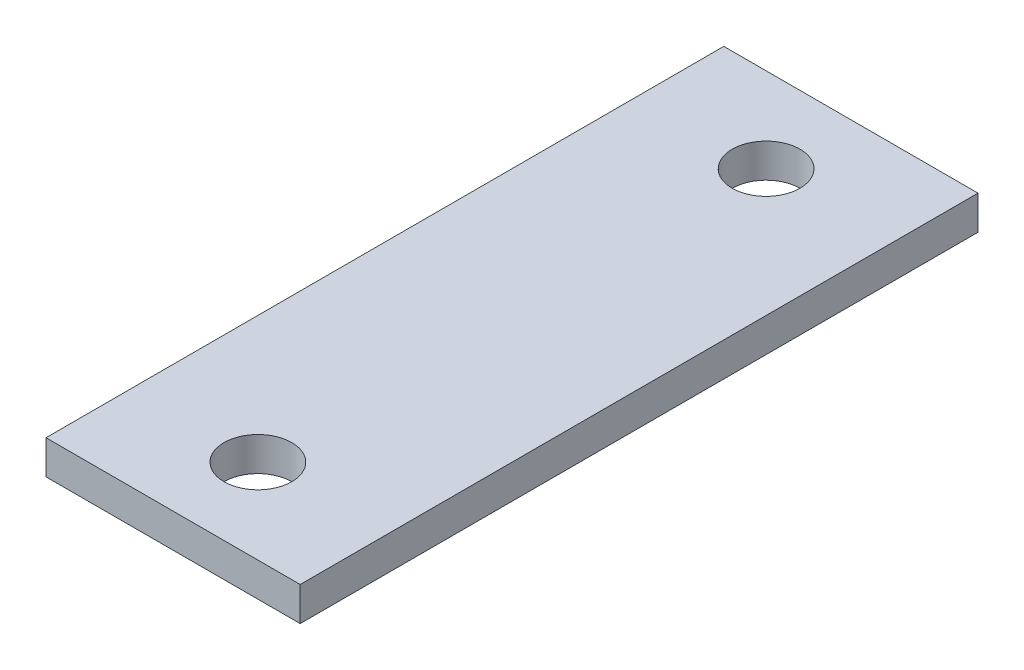
ISO-10303-21;
HEADER;
FILE_DESCRIPTION(('STEP AP214'),'2;1');
FILE_NAME('part.step','',(''),(''),'','','');
FILE_SCHEMA(('AUTOMOTIVE_DESIGN { 1 0 10303 214 1 1 1 1 }'));
ENDSEC;
DATA;
#1=APPLICATION_CONTEXT('core data for automotive mechanical design processes');
#2=APPLICATION_PROTOCOL_DEFINITION('international standard','automotive_design',2000,#1);
#3=PRODUCT_CONTEXT('',#1,'mechanical');
#4=PRODUCT('Part','Part','',(#3));
#5=PRODUCT_RELATED_PRODUCT_CATEGORY('part','',(#4));
#6=PRODUCT_DEFINITION_FORMATION('','',#4);
#7=PRODUCT_DEFINITION_CONTEXT('part definition',#1,'design');
#8=PRODUCT_DEFINITION('design','',#6,#7);
#9=PRODUCT_DEFINITION_SHAPE('','',#8);
#10=(LENGTH_UNIT() NAMED_UNIT(*) SI_UNIT(.MILLI.,.METRE.));
#11=(NAMED_UNIT(*) PLANE_ANGLE_UNIT() SI_UNIT($,.RADIAN.));
#12=(NAMED_UNIT(*) SI_UNIT($,.STERADIAN.) SOLID_ANGLE_UNIT());
#13=UNCERTAINTY_MEASURE_WITH_UNIT(LENGTH_MEASURE(1.E-05),#10,'distance_accuracy_value','');
#14=(GEOMETRIC_REPRESENTATION_CONTEXT(3) GLOBAL_UNCERTAINTY_ASSIGNED_CONTEXT((#13)) GLOBAL_UNIT_ASSIGNED_CONTEXT((#10,
#11,#12)) REPRESENTATION_CONTEXT('',''));
#15=CARTESIAN_POINT('',(0.,0.,0.));
#16=DIRECTION('',(0.,0.,1.));
#17=DIRECTION('',(1.,0.,0.));
#18=AXIS2_PLACEMENT_3D('',#15,#16,#17);
#19=CARTESIAN_POINT('',(-7.50000000000001,2.,20.));
#20=DIRECTION('',(1.,0.,0.));
#21=DIRECTION('',(0.,0.,-1.));
#22=AXIS2_PLACEMENT_3D('',#19,#20,#21);
#23=PLANE('',#22);
#24=DIRECTION('',(0.,0.,1.));
#25=VECTOR('',#24,1.);
#26=CARTESIAN_POINT('',(-7.50000000000001,0.,20.));
#27=LINE('',#26,#25);
#28=CARTESIAN_POINT('',(-7.50000000000001,0.,-20.));
#29=VERTEX_POINT('',#28);
#30=CARTESIAN_POINT('',(-7.50000000000001,0.,20.));
#31=VERTEX_POINT('',#30);
#32=EDGE_CURVE('E99',#29,#31,#27,.T.);
#33=ORIENTED_EDGE('',*,*,#32,.T.);
#34=DIRECTION('',(0.,-1.,0.));
#35=VECTOR('',#34,1.);
#36=CARTESIAN_POINT('',(-7.50000000000001,2.,20.));
#37=LINE('',#36,#35);
#38=CARTESIAN_POINT('',(-7.50000000000001,2.,20.));
#39=VERTEX_POINT('',#38);
#40=EDGE_CURVE('E11',#39,#31,#37,.T.);
#41=ORIENTED_EDGE('',*,*,#40,.F.);
#42=DIRECTION('',(0.,0.,1.));
#43=VECTOR('',#42,1.);
#44=CARTESIAN_POINT('',(-7.50000000000001,2.,20.));
#45=LINE('',#44,#43);
#46=CARTESIAN_POINT('',(-7.50000000000001,2.,-20.));
#47=VERTEX_POINT('',#46);
#48=EDGE_CURVE('E86',#47,#39,#45,.T.);
#49=ORIENTED_EDGE('',*,*,#48,.F.);
#50=DIRECTION('',(0.,-1.,0.));
#51=VECTOR('',#50,1.);
#52=CARTESIAN_POINT('',(-7.50000000000001,2.,-20.));
#53=LINE('',#52,#51);
#54=EDGE_CURVE('E95',#47,#29,#53,.T.);
#55=ORIENTED_EDGE('',*,*,#54,.T.);
#56=EDGE_LOOP('',(#33,#41,#49,#55));
#57=FACE_BOUND('',#56,.T.);
#58=ADVANCED_FACE('F33',(#57),#23,.F.);
#59=CARTESIAN_POINT('',(7.49999999999997,2.,20.));
#60=DIRECTION('',(0.,0.,-1.));
#61=DIRECTION('',(-1.,0.,0.));
#62=AXIS2_PLACEMENT_3D('',#59,#60,#61);
#63=PLANE('',#62);
#64=DIRECTION('',(1.,0.,0.));
#65=VECTOR('',#64,1.);
#66=CARTESIAN_POINT('',(7.49999999999997,0.,20.));
#67=LINE('',#66,#65);
#68=CARTESIAN_POINT('',(7.49999999999997,0.,20.));
#69=VERTEX_POINT('',#68);
#70=EDGE_CURVE('E90',#31,#69,#67,.T.);
#71=ORIENTED_EDGE('',*,*,#70,.T.);
#72=DIRECTION('',(0.,-1.,0.));
#73=VECTOR('',#72,1.);
#74=CARTESIAN_POINT('',(7.49999999999997,2.,20.));
#75=LINE('',#74,#73);
#76=CARTESIAN_POINT('',(7.49999999999997,2.,20.));
#77=VERTEX_POINT('',#76);
#78=EDGE_CURVE('E42',#77,#69,#75,.T.);
#79=ORIENTED_EDGE('',*,*,#78,.F.);
#80=DIRECTION('',(1.,0.,0.));
#81=VECTOR('',#80,1.);
#82=CARTESIAN_POINT('',(7.49999999999997,2.,20.));
#83=LINE('',#82,#81);
#84=EDGE_CURVE('E81',#39,#77,#83,.T.);
#85=ORIENTED_EDGE('',*,*,#84,.F.);
#86=ORIENTED_EDGE('',*,*,#40,.T.);
#87=EDGE_LOOP('',(#71,#79,#85,#86));
#88=FACE_BOUND('',#87,.T.);
#89=ADVANCED_FACE('F89',(#88),#63,.F.);
#90=CARTESIAN_POINT('',(7.49999999999997,2.,20.));
#91=DIRECTION('',(-1.,0.,0.));
#92=DIRECTION('',(0.,0.,1.));
#93=AXIS2_PLACEMENT_3D('',#90,#91,#92);
#94=PLANE('',#93);
#95=DIRECTION('',(0.,0.,-1.));
#96=VECTOR('',#95,1.);
#97=CARTESIAN_POINT('',(7.49999999999997,0.,20.));
#98=LINE('',#97,#96);
#99=CARTESIAN_POINT('',(7.49999999999998,0.,-20.));
#100=VERTEX_POINT('',#99);
#101=EDGE_CURVE('E68',#69,#100,#98,.T.);
#102=ORIENTED_EDGE('',*,*,#101,.T.);
#103=DIRECTION('',(0.,-1.,0.));
#104=VECTOR('',#103,1.);
#105=CARTESIAN_POINT('',(7.49999999999998,2.,-20.));
#106=LINE('',#105,#104);
#107=CARTESIAN_POINT('',(7.49999999999998,2.,-20.));
#108=VERTEX_POINT('',#107);
#109=EDGE_CURVE('E91',#108,#100,#106,.T.);
#110=ORIENTED_EDGE('',*,*,#109,.F.);
#111=DIRECTION('',(0.,0.,-1.));
#112=VECTOR('',#111,1.);
#113=CARTESIAN_POINT('',(7.49999999999997,2.,20.));
#114=LINE('',#113,#112);
#115=EDGE_CURVE('E84',#77,#108,#114,.T.);
#116=ORIENTED_EDGE('',*,*,#115,.F.);
#117=ORIENTED_EDGE('',*,*,#78,.T.);
#118=EDGE_LOOP('',(#102,#110,#116,#117));
#119=FACE_BOUND('',#118,.T.);
#120=ADVANCED_FACE('F93',(#119),#94,.F.);
#121=CARTESIAN_POINT('',(7.49999999999998,2.,-20.));
#122=DIRECTION('',(0.,0.,1.));
#123=DIRECTION('',(1.,0.,0.));
#124=AXIS2_PLACEMENT_3D('',#121,#122,#123);
#125=PLANE('',#124);
#126=DIRECTION('',(-1.,0.,0.));
#127=VECTOR('',#126,1.);
#128=CARTESIAN_POINT('',(7.49999999999998,0.,-20.));
#129=LINE('',#128,#127);
#130=EDGE_CURVE('E74',#100,#29,#129,.T.);
#131=ORIENTED_EDGE('',*,*,#130,.T.);
#132=ORIENTED_EDGE('',*,*,#54,.F.);
#133=DIRECTION('',(-1.,0.,0.));
#134=VECTOR('',#133,1.);
#135=CARTESIAN_POINT('',(7.49999999999998,2.,-20.));
#136=LINE('',#135,#134);
#137=EDGE_CURVE('E51',#108,#47,#136,.T.);
#138=ORIENTED_EDGE('',*,*,#137,.F.);
#139=ORIENTED_EDGE('',*,*,#109,.T.);
#140=EDGE_LOOP('',(#131,#132,#138,#139));
#141=FACE_BOUND('',#140,.T.);
#142=ADVANCED_FACE('F136',(#141),#125,.F.);
#143=CARTESIAN_POINT('',(0.,2.,0.));
#144=DIRECTION('',(0.,1.,0.));
#145=DIRECTION('',(0.,0.,1.));
#146=AXIS2_PLACEMENT_3D('',#143,#144,#145);
#147=PLANE('',#146);
#148=CARTESIAN_POINT('',(0.,2.,-14.9954637884817));
#149=DIRECTION('',(0.,1.,0.));
#150=DIRECTION('',(0.,0.,1.));
#151=AXIS2_PLACEMENT_3D('',#148,#149,#150);
#152=CIRCLE('',#151,2.);
#153=CARTESIAN_POINT('',(0.,2.,-12.9954637884817));
#154=VERTEX_POINT('',#153);
#155=EDGE_CURVE('E109',#154,#154,#152,.T.);
#156=ORIENTED_EDGE('',*,*,#155,.F.);
#157=EDGE_LOOP('',(#156));
#158=FACE_BOUND('',#157,.T.);
#159=CARTESIAN_POINT('',(0.,2.,14.9954637884817));
#160=DIRECTION('',(0.,1.,0.));
#161=DIRECTION('',(0.,0.,-1.));
#162=AXIS2_PLACEMENT_3D('',#159,#160,#161);
#163=CIRCLE('',#162,2.);
#164=CARTESIAN_POINT('',(0.,2.,12.9954637884817));
#165=VERTEX_POINT('',#164);
#166=EDGE_CURVE('E115',#165,#165,#163,.T.);
#167=ORIENTED_EDGE('',*,*,#166,.F.);
#168=EDGE_LOOP('',(#167));
#169=FACE_BOUND('',#168,.T.);
#170=ORIENTED_EDGE('',*,*,#48,.T.);
#171=ORIENTED_EDGE('',*,*,#84,.T.);
#172=ORIENTED_EDGE('',*,*,#115,.T.);
#173=ORIENTED_EDGE('',*,*,#137,.T.);
#174=EDGE_LOOP('',(#170,#171,#172,#173));
#175=FACE_BOUND('',#174,.T.);
#176=ADVANCED_FACE('F82',(#158,#169,#175),#147,.T.);
#177=CARTESIAN_POINT('',(0.,0.,0.));
#178=DIRECTION('',(0.,1.,0.));
#179=DIRECTION('',(0.,0.,1.));
#180=AXIS2_PLACEMENT_3D('',#177,#178,#179);
#181=PLANE('',#180);
#182=CARTESIAN_POINT('',(0.,0.,-14.9954637884817));
#183=DIRECTION('',(0.,1.,0.));
#184=DIRECTION('',(0.,0.,1.));
#185=AXIS2_PLACEMENT_3D('',#182,#183,#184);
#186=CIRCLE('',#185,2.);
#187=CARTESIAN_POINT('',(0.,0.,-12.9954637884817));
#188=VERTEX_POINT('',#187);
#189=EDGE_CURVE('E36',#188,#188,#186,.T.);
#190=ORIENTED_EDGE('',*,*,#189,.T.);
#191=EDGE_LOOP('',(#190));
#192=FACE_BOUND('',#191,.T.);
#193=CARTESIAN_POINT('',(0.,0.,14.9954637884817));
#194=DIRECTION('',(0.,1.,0.));
#195=DIRECTION('',(0.,0.,1.));
#196=AXIS2_PLACEMENT_3D('',#193,#194,#195);
#197=CIRCLE('',#196,2.);
#198=CARTESIAN_POINT('',(0.,0.,16.9954637884817));
#199=VERTEX_POINT('',#198);
#200=EDGE_CURVE('E107',#199,#199,#197,.T.);
#201=ORIENTED_EDGE('',*,*,#200,.T.);
#202=EDGE_LOOP('',(#201));
#203=FACE_BOUND('',#202,.T.);
#204=CARTESIAN_POINT('',(0.,0.,0.));
#205=DIRECTION('',(0.,-1.,0.));
#206=DIRECTION('',(0.,0.,-1.));
#207=AXIS2_PLACEMENT_3D('',#204,#205,#206);
#208=CIRCLE('',#207,1.5);
#209=CARTESIAN_POINT('',(0.,0.,-1.5));
#210=VERTEX_POINT('',#209);
#211=EDGE_CURVE('E113',#210,#210,#208,.T.);
#212=ORIENTED_EDGE('',*,*,#211,.F.);
#213=EDGE_LOOP('',(#212));
#214=FACE_BOUND('',#213,.T.);
#215=ORIENTED_EDGE('',*,*,#32,.F.);
#216=ORIENTED_EDGE('',*,*,#130,.F.);
#217=ORIENTED_EDGE('',*,*,#101,.F.);
#218=ORIENTED_EDGE('',*,*,#70,.F.);
#219=EDGE_LOOP('',(#215,#216,#217,#218));
#220=FACE_BOUND('',#219,.T.);
#221=ADVANCED_FACE('F129',(#192,#203,#214,#220),#181,.F.);
#222=CARTESIAN_POINT('',(0.,0.5,0.));
#223=DIRECTION('',(0.,-1.,0.));
#224=DIRECTION('',(0.,0.,-1.));
#225=AXIS2_PLACEMENT_3D('',#222,#223,#224);
#226=CYLINDRICAL_SURFACE('',#225,1.5);
#227=CARTESIAN_POINT('',(0.,0.5,0.));
#228=DIRECTION('',(0.,-1.,0.));
#229=DIRECTION('',(0.,0.,-1.));
#230=AXIS2_PLACEMENT_3D('',#227,#228,#229);
#231=CIRCLE('',#230,1.5);
#232=CARTESIAN_POINT('',(0.,0.5,-1.5));
#233=VERTEX_POINT('',#232);
#234=EDGE_CURVE('E102',#233,#233,#231,.T.);
#235=ORIENTED_EDGE('',*,*,#234,.F.);
#236=EDGE_LOOP('',(#235));
#237=FACE_BOUND('',#236,.T.);
#238=ORIENTED_EDGE('',*,*,#211,.T.);
#239=EDGE_LOOP('',(#238));
#240=FACE_BOUND('',#239,.T.);
#241=ADVANCED_FACE('F127',(#237,#240),#226,.F.);
#242=CARTESIAN_POINT('',(0.,0.5,0.));
#243=DIRECTION('',(0.,-1.,0.));
#244=DIRECTION('',(0.,0.,-1.));
#245=AXIS2_PLACEMENT_3D('',#242,#243,#244);
#246=PLANE('',#245);
#247=ORIENTED_EDGE('',*,*,#234,.T.);
#248=EDGE_LOOP('',(#247));
#249=FACE_BOUND('',#248,.T.);
#250=ADVANCED_FACE('F170',(#249),#246,.T.);
#251=CARTESIAN_POINT('',(0.,-8.,14.9954637884817));
#252=DIRECTION('',(0.,1.,0.));
#253=DIRECTION('',(0.,0.,1.));
#254=AXIS2_PLACEMENT_3D('',#251,#252,#253);
#255=CYLINDRICAL_SURFACE('',#254,2.);
#256=ORIENTED_EDGE('',*,*,#166,.T.);
#257=EDGE_LOOP('',(#256));
#258=FACE_BOUND('',#257,.T.);
#259=ORIENTED_EDGE('',*,*,#200,.F.);
#260=EDGE_LOOP('',(#259));
#261=FACE_BOUND('',#260,.T.);
#262=ADVANCED_FACE('F181',(#258,#261),#255,.F.);
#263=CARTESIAN_POINT('',(0.,-8.,-14.9954637884817));
#264=DIRECTION('',(0.,1.,0.));
#265=DIRECTION('',(0.,0.,1.));
#266=AXIS2_PLACEMENT_3D('',#263,#264,#265);
#267=CYLINDRICAL_SURFACE('',#266,2.);
#268=ORIENTED_EDGE('',*,*,#155,.T.);
#269=EDGE_LOOP('',(#268));
#270=FACE_BOUND('',#269,.T.);
#271=ORIENTED_EDGE('',*,*,#189,.F.);
#272=EDGE_LOOP('',(#271));
#273=FACE_BOUND('',#272,.T.);
#274=ADVANCED_FACE('F201',(#270,#273),#267,.F.);
#275=CLOSED_SHELL('',(#58,#89,#120,#142,#176,#221,#241,#250,#262,#274));
#276=MANIFOLD_SOLID_BREP('B2',#275);
#277=ADVANCED_BREP_SHAPE_REPRESENTATION('',(#18,#276),#14);
#278=SHAPE_DEFINITION_REPRESENTATION(#9,#277);
ENDSEC;
END-ISO-10303-21;
